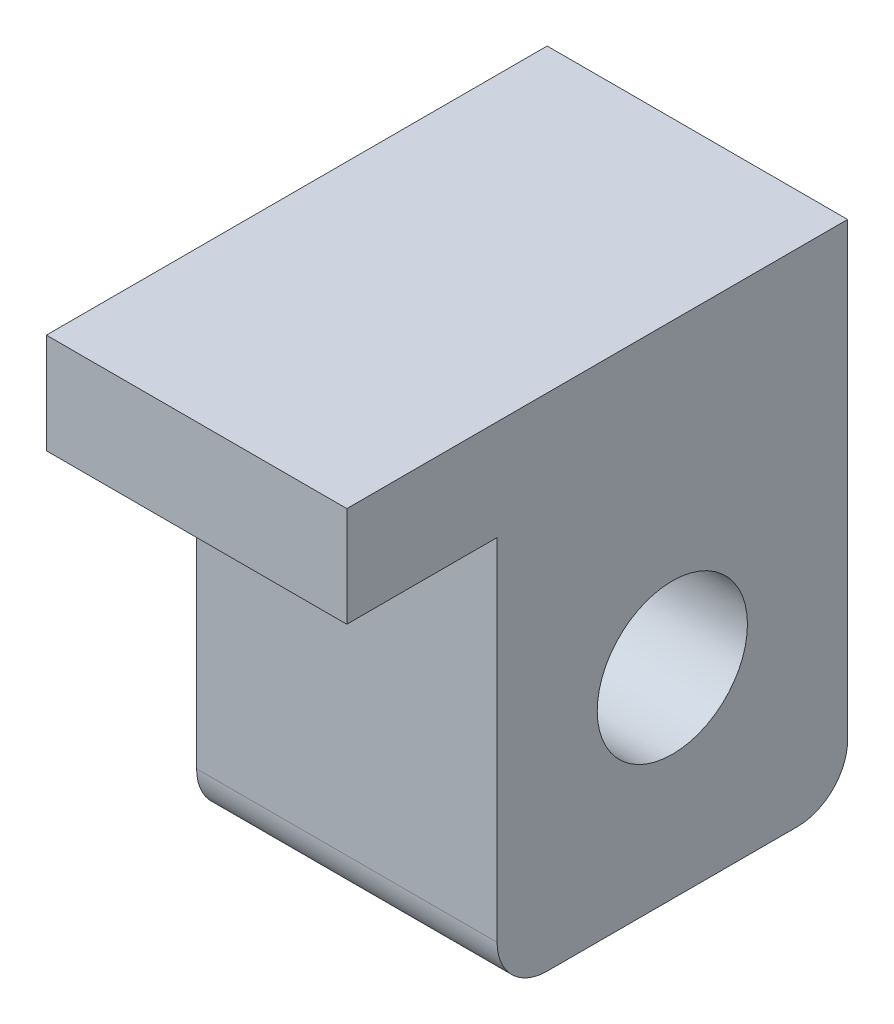
ISO-10303-21;
HEADER;
FILE_DESCRIPTION(('STEP AP214'),'2;1');
FILE_NAME('part.step','',(''),(''),'','','');
FILE_SCHEMA(('AUTOMOTIVE_DESIGN { 1 0 10303 214 1 1 1 1 }'));
ENDSEC;
DATA;
#1=APPLICATION_CONTEXT('core data for automotive mechanical design processes');
#2=APPLICATION_PROTOCOL_DEFINITION('international standard','automotive_design',2000,#1);
#3=PRODUCT_CONTEXT('',#1,'mechanical');
#4=PRODUCT('Part','Part','',(#3));
#5=PRODUCT_RELATED_PRODUCT_CATEGORY('part','',(#4));
#6=PRODUCT_DEFINITION_FORMATION('','',#4);
#7=PRODUCT_DEFINITION_CONTEXT('part definition',#1,'design');
#8=PRODUCT_DEFINITION('design','',#6,#7);
#9=PRODUCT_DEFINITION_SHAPE('','',#8);
#10=(LENGTH_UNIT() NAMED_UNIT(*) SI_UNIT(.MILLI.,.METRE.));
#11=(NAMED_UNIT(*) PLANE_ANGLE_UNIT() SI_UNIT($,.RADIAN.));
#12=(NAMED_UNIT(*) SI_UNIT($,.STERADIAN.) SOLID_ANGLE_UNIT());
#13=UNCERTAINTY_MEASURE_WITH_UNIT(LENGTH_MEASURE(1.E-05),#10,'distance_accuracy_value','');
#14=(GEOMETRIC_REPRESENTATION_CONTEXT(3) GLOBAL_UNCERTAINTY_ASSIGNED_CONTEXT((#13)) GLOBAL_UNIT_ASSIGNED_CONTEXT((#10,
#11,#12)) REPRESENTATION_CONTEXT('',''));
#15=CARTESIAN_POINT('',(0.,0.,0.));
#16=DIRECTION('',(0.,0.,1.));
#17=DIRECTION('',(1.,0.,0.));
#18=AXIS2_PLACEMENT_3D('',#15,#16,#17);
#19=CARTESIAN_POINT('',(30.,-25.,17.5));
#20=DIRECTION('',(0.,0.,-1.));
#21=DIRECTION('',(-1.,0.,0.));
#22=AXIS2_PLACEMENT_3D('',#19,#20,#21);
#23=PLANE('',#22);
#24=DIRECTION('',(-1.,0.,0.));
#25=VECTOR('',#24,1.);
#26=CARTESIAN_POINT('',(30.,15.,17.5));
#27=LINE('',#26,#25);
#28=CARTESIAN_POINT('',(30.,15.,17.5));
#29=VERTEX_POINT('',#28);
#30=CARTESIAN_POINT('',(0.,15.,17.5));
#31=VERTEX_POINT('',#30);
#32=EDGE_CURVE('E116',#29,#31,#27,.T.);
#33=ORIENTED_EDGE('',*,*,#32,.T.);
#34=DIRECTION('',(0.,-1.,0.));
#35=VECTOR('',#34,1.);
#36=CARTESIAN_POINT('',(0.,-25.,17.5));
#37=LINE('',#36,#35);
#38=CARTESIAN_POINT('',(0.,-20.,17.5));
#39=VERTEX_POINT('',#38);
#40=EDGE_CURVE('E104',#31,#39,#37,.T.);
#41=ORIENTED_EDGE('',*,*,#40,.T.);
#42=DIRECTION('',(-1.,0.,0.));
#43=VECTOR('',#42,1.);
#44=CARTESIAN_POINT('',(30.,-20.,17.5));
#45=LINE('',#44,#43);
#46=CARTESIAN_POINT('',(30.,-20.,17.5));
#47=VERTEX_POINT('',#46);
#48=EDGE_CURVE('E49',#39,#47,#45,.F.);
#49=ORIENTED_EDGE('',*,*,#48,.T.);
#50=DIRECTION('',(0.,-1.,0.));
#51=VECTOR('',#50,1.);
#52=CARTESIAN_POINT('',(30.,-25.,17.5));
#53=LINE('',#52,#51);
#54=EDGE_CURVE('E56',#29,#47,#53,.T.);
#55=ORIENTED_EDGE('',*,*,#54,.F.);
#56=EDGE_LOOP('',(#33,#41,#49,#55));
#57=FACE_BOUND('',#56,.T.);
#58=ADVANCED_FACE('F41',(#57),#23,.F.);
#59=CARTESIAN_POINT('',(30.,-25.,-17.5));
#60=DIRECTION('',(0.,0.,1.));
#61=DIRECTION('',(1.,0.,0.));
#62=AXIS2_PLACEMENT_3D('',#59,#60,#61);
#63=PLANE('',#62);
#64=DIRECTION('',(0.,1.,0.));
#65=VECTOR('',#64,1.);
#66=CARTESIAN_POINT('',(30.,-25.,-17.5));
#67=LINE('',#66,#65);
#68=CARTESIAN_POINT('',(30.,-20.,-17.5));
#69=VERTEX_POINT('',#68);
#70=CARTESIAN_POINT('',(30.,25.,-17.5));
#71=VERTEX_POINT('',#70);
#72=EDGE_CURVE('E167',#69,#71,#67,.T.);
#73=ORIENTED_EDGE('',*,*,#72,.F.);
#74=DIRECTION('',(-1.,0.,0.));
#75=VECTOR('',#74,1.);
#76=CARTESIAN_POINT('',(30.,-20.,-17.5));
#77=LINE('',#76,#75);
#78=CARTESIAN_POINT('',(0.,-20.,-17.5));
#79=VERTEX_POINT('',#78);
#80=EDGE_CURVE('E180',#69,#79,#77,.T.);
#81=ORIENTED_EDGE('',*,*,#80,.T.);
#82=DIRECTION('',(0.,1.,0.));
#83=VECTOR('',#82,1.);
#84=CARTESIAN_POINT('',(0.,-25.,-17.5));
#85=LINE('',#84,#83);
#86=CARTESIAN_POINT('',(0.,25.,-17.5));
#87=VERTEX_POINT('',#86);
#88=EDGE_CURVE('E166',#79,#87,#85,.T.);
#89=ORIENTED_EDGE('',*,*,#88,.T.);
#90=DIRECTION('',(-1.,0.,0.));
#91=VECTOR('',#90,1.);
#92=CARTESIAN_POINT('',(30.,25.,-17.5));
#93=LINE('',#92,#91);
#94=EDGE_CURVE('E174',#71,#87,#93,.T.);
#95=ORIENTED_EDGE('',*,*,#94,.F.);
#96=EDGE_LOOP('',(#73,#81,#89,#95));
#97=FACE_BOUND('',#96,.T.);
#98=ADVANCED_FACE('F210',(#97),#63,.F.);
#99=CARTESIAN_POINT('',(30.,25.,17.5));
#100=DIRECTION('',(0.,-1.,0.));
#101=DIRECTION('',(0.,0.,-1.));
#102=AXIS2_PLACEMENT_3D('',#99,#100,#101);
#103=PLANE('',#102);
#104=DIRECTION('',(0.,0.,1.));
#105=VECTOR('',#104,1.);
#106=CARTESIAN_POINT('',(0.,25.,17.5));
#107=LINE('',#106,#105);
#108=CARTESIAN_POINT('',(0.,25.,32.5));
#109=VERTEX_POINT('',#108);
#110=EDGE_CURVE('E114',#87,#109,#107,.T.);
#111=ORIENTED_EDGE('',*,*,#110,.T.);
#112=DIRECTION('',(1.,0.,0.));
#113=VECTOR('',#112,1.);
#114=CARTESIAN_POINT('',(30.,25.,32.5));
#115=LINE('',#114,#113);
#116=CARTESIAN_POINT('',(30.,25.,32.5));
#117=VERTEX_POINT('',#116);
#118=EDGE_CURVE('E129',#109,#117,#115,.T.);
#119=ORIENTED_EDGE('',*,*,#118,.T.);
#120=DIRECTION('',(0.,0.,1.));
#121=VECTOR('',#120,1.);
#122=CARTESIAN_POINT('',(30.,25.,17.5));
#123=LINE('',#122,#121);
#124=EDGE_CURVE('E169',#71,#117,#123,.T.);
#125=ORIENTED_EDGE('',*,*,#124,.F.);
#126=ORIENTED_EDGE('',*,*,#94,.T.);
#127=EDGE_LOOP('',(#111,#119,#125,#126));
#128=FACE_BOUND('',#127,.T.);
#129=ADVANCED_FACE('F214',(#128),#103,.F.);
#130=CARTESIAN_POINT('',(30.,-25.,17.5));
#131=DIRECTION('',(0.,1.,0.));
#132=DIRECTION('',(0.,0.,1.));
#133=AXIS2_PLACEMENT_3D('',#130,#131,#132);
#134=PLANE('',#133);
#135=DIRECTION('',(0.,0.,-1.));
#136=VECTOR('',#135,1.);
#137=CARTESIAN_POINT('',(30.,-25.,17.5));
#138=LINE('',#137,#136);
#139=CARTESIAN_POINT('',(30.,-25.,12.5));
#140=VERTEX_POINT('',#139);
#141=CARTESIAN_POINT('',(30.,-25.,-12.5));
#142=VERTEX_POINT('',#141);
#143=EDGE_CURVE('E172',#140,#142,#138,.T.);
#144=ORIENTED_EDGE('',*,*,#143,.F.);
#145=DIRECTION('',(-1.,0.,0.));
#146=VECTOR('',#145,1.);
#147=CARTESIAN_POINT('',(30.,-25.,12.5));
#148=LINE('',#147,#146);
#149=CARTESIAN_POINT('',(0.,-25.,12.5));
#150=VERTEX_POINT('',#149);
#151=EDGE_CURVE('E191',#140,#150,#148,.T.);
#152=ORIENTED_EDGE('',*,*,#151,.T.);
#153=DIRECTION('',(0.,0.,-1.));
#154=VECTOR('',#153,1.);
#155=CARTESIAN_POINT('',(0.,-25.,17.5));
#156=LINE('',#155,#154);
#157=CARTESIAN_POINT('',(0.,-25.,-12.5));
#158=VERTEX_POINT('',#157);
#159=EDGE_CURVE('E113',#150,#158,#156,.T.);
#160=ORIENTED_EDGE('',*,*,#159,.T.);
#161=DIRECTION('',(-1.,0.,0.));
#162=VECTOR('',#161,1.);
#163=CARTESIAN_POINT('',(30.,-25.,-12.5));
#164=LINE('',#163,#162);
#165=EDGE_CURVE('E186',#158,#142,#164,.F.);
#166=ORIENTED_EDGE('',*,*,#165,.T.);
#167=EDGE_LOOP('',(#144,#152,#160,#166));
#168=FACE_BOUND('',#167,.T.);
#169=ADVANCED_FACE('F200',(#168),#134,.F.);
#170=CARTESIAN_POINT('',(30.,0.,0.));
#171=DIRECTION('',(-1.,0.,0.));
#172=DIRECTION('',(0.,0.,1.));
#173=AXIS2_PLACEMENT_3D('',#170,#171,#172);
#174=PLANE('',#173);
#175=CARTESIAN_POINT('',(30.,-5.,0.));
#176=DIRECTION('',(-1.,0.,0.));
#177=DIRECTION('',(0.,0.,1.));
#178=AXIS2_PLACEMENT_3D('',#175,#176,#177);
#179=CIRCLE('',#178,7.5);
#180=CARTESIAN_POINT('',(30.,-5.,7.5));
#181=VERTEX_POINT('',#180);
#182=EDGE_CURVE('E163',#181,#181,#179,.T.);
#183=ORIENTED_EDGE('',*,*,#182,.T.);
#184=EDGE_LOOP('',(#183));
#185=FACE_BOUND('',#184,.T.);
#186=ORIENTED_EDGE('',*,*,#124,.T.);
#187=DIRECTION('',(0.,1.,0.));
#188=VECTOR('',#187,1.);
#189=CARTESIAN_POINT('',(30.,15.,32.5));
#190=LINE('',#189,#188);
#191=CARTESIAN_POINT('',(30.,15.,32.5));
#192=VERTEX_POINT('',#191);
#193=EDGE_CURVE('E132',#192,#117,#190,.T.);
#194=ORIENTED_EDGE('',*,*,#193,.F.);
#195=DIRECTION('',(0.,0.,-1.));
#196=VECTOR('',#195,1.);
#197=CARTESIAN_POINT('',(30.,15.,32.5));
#198=LINE('',#197,#196);
#199=EDGE_CURVE('E119',#192,#29,#198,.T.);
#200=ORIENTED_EDGE('',*,*,#199,.T.);
#201=ORIENTED_EDGE('',*,*,#54,.T.);
#202=CARTESIAN_POINT('',(30.,-20.,12.5));
#203=DIRECTION('',(-1.,0.,0.));
#204=DIRECTION('',(0.,0.,1.));
#205=AXIS2_PLACEMENT_3D('',#202,#203,#204);
#206=CIRCLE('',#205,5.);
#207=EDGE_CURVE('E11',#47,#140,#206,.F.);
#208=ORIENTED_EDGE('',*,*,#207,.T.);
#209=ORIENTED_EDGE('',*,*,#143,.T.);
#210=CARTESIAN_POINT('',(30.,-20.,-12.5));
#211=DIRECTION('',(-1.,0.,0.));
#212=DIRECTION('',(0.,0.,1.));
#213=AXIS2_PLACEMENT_3D('',#210,#211,#212);
#214=CIRCLE('',#213,5.);
#215=EDGE_CURVE('E189',#142,#69,#214,.F.);
#216=ORIENTED_EDGE('',*,*,#215,.T.);
#217=ORIENTED_EDGE('',*,*,#72,.T.);
#218=EDGE_LOOP('',(#186,#194,#200,#201,#208,#209,#216,#217));
#219=FACE_BOUND('',#218,.T.);
#220=ADVANCED_FACE('F198',(#185,#219),#174,.F.);
#221=CARTESIAN_POINT('',(0.,0.,0.));
#222=DIRECTION('',(-1.,0.,0.));
#223=DIRECTION('',(0.,0.,1.));
#224=AXIS2_PLACEMENT_3D('',#221,#222,#223);
#225=PLANE('',#224);
#226=CARTESIAN_POINT('',(0.,-16.3137084989858,11.3137084989854));
#227=DIRECTION('',(-1.,0.,0.));
#228=DIRECTION('',(0.,0.,1.));
#229=AXIS2_PLACEMENT_3D('',#226,#227,#228);
#230=CIRCLE('',#229,2.74999999999982);
#231=CARTESIAN_POINT('',(0.,-16.3137084989858,14.0637084989852));
#232=VERTEX_POINT('',#231);
#233=EDGE_CURVE('E150',#232,#232,#230,.T.);
#234=ORIENTED_EDGE('',*,*,#233,.F.);
#235=EDGE_LOOP('',(#234));
#236=FACE_BOUND('',#235,.T.);
#237=CARTESIAN_POINT('',(0.,-16.3137084989858,-11.3137084989841));
#238=DIRECTION('',(-1.,0.,0.));
#239=DIRECTION('',(0.,0.,1.));
#240=AXIS2_PLACEMENT_3D('',#237,#238,#239);
#241=CIRCLE('',#240,2.74999999999982);
#242=CARTESIAN_POINT('',(0.,-16.3137084989858,-8.56370849898425));
#243=VERTEX_POINT('',#242);
#244=EDGE_CURVE('E144',#243,#243,#241,.T.);
#245=ORIENTED_EDGE('',*,*,#244,.F.);
#246=EDGE_LOOP('',(#245));
#247=FACE_BOUND('',#246,.T.);
#248=CARTESIAN_POINT('',(0.,6.31370849898377,-11.3137084989841));
#249=DIRECTION('',(-1.,0.,0.));
#250=DIRECTION('',(0.,0.,1.));
#251=AXIS2_PLACEMENT_3D('',#248,#249,#250);
#252=CIRCLE('',#251,2.74999999999982);
#253=CARTESIAN_POINT('',(0.,6.31370849898377,-8.56370849898425));
#254=VERTEX_POINT('',#253);
#255=EDGE_CURVE('E137',#254,#254,#252,.T.);
#256=ORIENTED_EDGE('',*,*,#255,.F.);
#257=EDGE_LOOP('',(#256));
#258=FACE_BOUND('',#257,.T.);
#259=CARTESIAN_POINT('',(0.,6.31370849898377,11.3137084989854));
#260=DIRECTION('',(-1.,0.,0.));
#261=DIRECTION('',(0.,0.,1.));
#262=AXIS2_PLACEMENT_3D('',#259,#260,#261);
#263=CIRCLE('',#262,2.74999999999982);
#264=CARTESIAN_POINT('',(0.,6.31370849898377,14.0637084989852));
#265=VERTEX_POINT('',#264);
#266=EDGE_CURVE('E140',#265,#265,#263,.T.);
#267=ORIENTED_EDGE('',*,*,#266,.F.);
#268=EDGE_LOOP('',(#267));
#269=FACE_BOUND('',#268,.T.);
#270=CARTESIAN_POINT('',(0.,-5.,0.));
#271=DIRECTION('',(1.,0.,0.));
#272=DIRECTION('',(0.,0.,-1.));
#273=AXIS2_PLACEMENT_3D('',#270,#271,#272);
#274=CIRCLE('',#273,7.5);
#275=CARTESIAN_POINT('',(0.,-5.,-7.5));
#276=VERTEX_POINT('',#275);
#277=EDGE_CURVE('E158',#276,#276,#274,.T.);
#278=ORIENTED_EDGE('',*,*,#277,.T.);
#279=EDGE_LOOP('',(#278));
#280=FACE_BOUND('',#279,.T.);
#281=ORIENTED_EDGE('',*,*,#159,.F.);
#282=CARTESIAN_POINT('',(0.,-20.,12.5));
#283=DIRECTION('',(-1.,0.,0.));
#284=DIRECTION('',(0.,0.,1.));
#285=AXIS2_PLACEMENT_3D('',#282,#283,#284);
#286=CIRCLE('',#285,5.);
#287=EDGE_CURVE('E111',#150,#39,#286,.T.);
#288=ORIENTED_EDGE('',*,*,#287,.T.);
#289=ORIENTED_EDGE('',*,*,#40,.F.);
#290=DIRECTION('',(0.,0.,1.));
#291=VECTOR('',#290,1.);
#292=CARTESIAN_POINT('',(0.,15.,32.5));
#293=LINE('',#292,#291);
#294=CARTESIAN_POINT('',(0.,15.,32.5));
#295=VERTEX_POINT('',#294);
#296=EDGE_CURVE('E109',#31,#295,#293,.T.);
#297=ORIENTED_EDGE('',*,*,#296,.T.);
#298=DIRECTION('',(0.,1.,0.));
#299=VECTOR('',#298,1.);
#300=CARTESIAN_POINT('',(0.,15.,32.5));
#301=LINE('',#300,#299);
#302=EDGE_CURVE('E125',#295,#109,#301,.T.);
#303=ORIENTED_EDGE('',*,*,#302,.T.);
#304=ORIENTED_EDGE('',*,*,#110,.F.);
#305=ORIENTED_EDGE('',*,*,#88,.F.);
#306=CARTESIAN_POINT('',(0.,-20.,-12.5));
#307=DIRECTION('',(-1.,0.,0.));
#308=DIRECTION('',(0.,0.,1.));
#309=AXIS2_PLACEMENT_3D('',#306,#307,#308);
#310=CIRCLE('',#309,5.);
#311=EDGE_CURVE('E183',#79,#158,#310,.T.);
#312=ORIENTED_EDGE('',*,*,#311,.T.);
#313=EDGE_LOOP('',(#281,#288,#289,#297,#303,#304,#305,#312));
#314=FACE_BOUND('',#313,.T.);
#315=ADVANCED_FACE('F106',(#236,#247,#258,#269,#280,#314),#225,.T.);
#316=CARTESIAN_POINT('',(0.,-5.,0.));
#317=DIRECTION('',(1.,0.,0.));
#318=DIRECTION('',(0.,0.,-1.));
#319=AXIS2_PLACEMENT_3D('',#316,#317,#318);
#320=CYLINDRICAL_SURFACE('',#319,7.5);
#321=ORIENTED_EDGE('',*,*,#277,.F.);
#322=EDGE_LOOP('',(#321));
#323=FACE_BOUND('',#322,.T.);
#324=ORIENTED_EDGE('',*,*,#182,.F.);
#325=EDGE_LOOP('',(#324));
#326=FACE_BOUND('',#325,.T.);
#327=ADVANCED_FACE('F242',(#323,#326),#320,.F.);
#328=CARTESIAN_POINT('',(30.,-20.,-12.5));
#329=DIRECTION('',(-1.,0.,0.));
#330=DIRECTION('',(0.,0.,1.));
#331=AXIS2_PLACEMENT_3D('',#328,#329,#330);
#332=CYLINDRICAL_SURFACE('',#331,5.);
#333=ORIENTED_EDGE('',*,*,#215,.F.);
#334=ORIENTED_EDGE('',*,*,#165,.F.);
#335=ORIENTED_EDGE('',*,*,#311,.F.);
#336=ORIENTED_EDGE('',*,*,#80,.F.);
#337=EDGE_LOOP('',(#333,#334,#335,#336));
#338=FACE_BOUND('',#337,.T.);
#339=ADVANCED_FACE('F205',(#338),#332,.T.);
#340=CARTESIAN_POINT('',(30.,-20.,12.5));
#341=DIRECTION('',(-1.,0.,0.));
#342=DIRECTION('',(0.,0.,1.));
#343=AXIS2_PLACEMENT_3D('',#340,#341,#342);
#344=CYLINDRICAL_SURFACE('',#343,5.);
#345=ORIENTED_EDGE('',*,*,#207,.F.);
#346=ORIENTED_EDGE('',*,*,#48,.F.);
#347=ORIENTED_EDGE('',*,*,#287,.F.);
#348=ORIENTED_EDGE('',*,*,#151,.F.);
#349=EDGE_LOOP('',(#345,#346,#347,#348));
#350=FACE_BOUND('',#349,.T.);
#351=ADVANCED_FACE('F43',(#350),#344,.T.);
#352=CARTESIAN_POINT('',(20.,6.31370849898377,11.3137084989854));
#353=DIRECTION('',(-1.,0.,0.));
#354=DIRECTION('',(0.,0.,1.));
#355=AXIS2_PLACEMENT_3D('',#352,#353,#354);
#356=CYLINDRICAL_SURFACE('',#355,2.74999999999982);
#357=CARTESIAN_POINT('',(20.,6.31370849898377,11.3137084989854));
#358=DIRECTION('',(-1.,0.,0.));
#359=DIRECTION('',(0.,0.,1.));
#360=AXIS2_PLACEMENT_3D('',#357,#358,#359);
#361=CIRCLE('',#360,2.74999999999982);
#362=CARTESIAN_POINT('',(20.,6.31370849898377,14.0637084989852));
#363=VERTEX_POINT('',#362);
#364=EDGE_CURVE('E155',#363,#363,#361,.T.);
#365=ORIENTED_EDGE('',*,*,#364,.F.);
#366=EDGE_LOOP('',(#365));
#367=FACE_BOUND('',#366,.T.);
#368=ORIENTED_EDGE('',*,*,#266,.T.);
#369=EDGE_LOOP('',(#368));
#370=FACE_BOUND('',#369,.T.);
#371=ADVANCED_FACE('F247',(#367,#370),#356,.F.);
#372=CARTESIAN_POINT('',(20.,6.31370849898377,11.3137084989854));
#373=DIRECTION('',(-1.,0.,0.));
#374=DIRECTION('',(0.,0.,1.));
#375=AXIS2_PLACEMENT_3D('',#372,#373,#374);
#376=PLANE('',#375);
#377=ORIENTED_EDGE('',*,*,#364,.T.);
#378=EDGE_LOOP('',(#377));
#379=FACE_BOUND('',#378,.T.);
#380=ADVANCED_FACE('F280',(#379),#376,.T.);
#381=CARTESIAN_POINT('',(20.,6.31370849898377,-11.3137084989841));
#382=DIRECTION('',(-1.,0.,0.));
#383=DIRECTION('',(0.,0.,1.));
#384=AXIS2_PLACEMENT_3D('',#381,#382,#383);
#385=CYLINDRICAL_SURFACE('',#384,2.74999999999982);
#386=CARTESIAN_POINT('',(20.,6.31370849898377,-11.3137084989841));
#387=DIRECTION('',(-1.,0.,0.));
#388=DIRECTION('',(0.,0.,1.));
#389=AXIS2_PLACEMENT_3D('',#386,#387,#388);
#390=CIRCLE('',#389,2.74999999999982);
#391=CARTESIAN_POINT('',(20.,6.31370849898377,-8.56370849898425));
#392=VERTEX_POINT('',#391);
#393=EDGE_CURVE('E141',#392,#392,#390,.T.);
#394=ORIENTED_EDGE('',*,*,#393,.F.);
#395=EDGE_LOOP('',(#394));
#396=FACE_BOUND('',#395,.T.);
#397=ORIENTED_EDGE('',*,*,#255,.T.);
#398=EDGE_LOOP('',(#397));
#399=FACE_BOUND('',#398,.T.);
#400=ADVANCED_FACE('F288',(#396,#399),#385,.F.);
#401=CARTESIAN_POINT('',(20.,6.31370849898377,-11.3137084989841));
#402=DIRECTION('',(-1.,0.,0.));
#403=DIRECTION('',(0.,0.,1.));
#404=AXIS2_PLACEMENT_3D('',#401,#402,#403);
#405=PLANE('',#404);
#406=ORIENTED_EDGE('',*,*,#393,.T.);
#407=EDGE_LOOP('',(#406));
#408=FACE_BOUND('',#407,.T.);
#409=ADVANCED_FACE('F296',(#408),#405,.T.);
#410=CARTESIAN_POINT('',(20.,-16.3137084989858,-11.3137084989841));
#411=DIRECTION('',(-1.,0.,0.));
#412=DIRECTION('',(0.,0.,1.));
#413=AXIS2_PLACEMENT_3D('',#410,#411,#412);
#414=CYLINDRICAL_SURFACE('',#413,2.74999999999982);
#415=CARTESIAN_POINT('',(20.,-16.3137084989858,-11.3137084989841));
#416=DIRECTION('',(-1.,0.,0.));
#417=DIRECTION('',(0.,0.,1.));
#418=AXIS2_PLACEMENT_3D('',#415,#416,#417);
#419=CIRCLE('',#418,2.74999999999982);
#420=CARTESIAN_POINT('',(20.,-16.3137084989858,-8.56370849898425));
#421=VERTEX_POINT('',#420);
#422=EDGE_CURVE('E147',#421,#421,#419,.T.);
#423=ORIENTED_EDGE('',*,*,#422,.F.);
#424=EDGE_LOOP('',(#423));
#425=FACE_BOUND('',#424,.T.);
#426=ORIENTED_EDGE('',*,*,#244,.T.);
#427=EDGE_LOOP('',(#426));
#428=FACE_BOUND('',#427,.T.);
#429=ADVANCED_FACE('F304',(#425,#428),#414,.F.);
#430=CARTESIAN_POINT('',(20.,-16.3137084989858,-11.3137084989841));
#431=DIRECTION('',(-1.,0.,0.));
#432=DIRECTION('',(0.,0.,1.));
#433=AXIS2_PLACEMENT_3D('',#430,#431,#432);
#434=PLANE('',#433);
#435=ORIENTED_EDGE('',*,*,#422,.T.);
#436=EDGE_LOOP('',(#435));
#437=FACE_BOUND('',#436,.T.);
#438=ADVANCED_FACE('F313',(#437),#434,.T.);
#439=CARTESIAN_POINT('',(20.,-16.3137084989858,11.3137084989854));
#440=DIRECTION('',(-1.,0.,0.));
#441=DIRECTION('',(0.,0.,1.));
#442=AXIS2_PLACEMENT_3D('',#439,#440,#441);
#443=CYLINDRICAL_SURFACE('',#442,2.74999999999982);
#444=CARTESIAN_POINT('',(20.,-16.3137084989858,11.3137084989854));
#445=DIRECTION('',(-1.,0.,0.));
#446=DIRECTION('',(0.,0.,1.));
#447=AXIS2_PLACEMENT_3D('',#444,#445,#446);
#448=CIRCLE('',#447,2.74999999999982);
#449=CARTESIAN_POINT('',(20.,-16.3137084989858,14.0637084989852));
#450=VERTEX_POINT('',#449);
#451=EDGE_CURVE('E135',#450,#450,#448,.T.);
#452=ORIENTED_EDGE('',*,*,#451,.F.);
#453=EDGE_LOOP('',(#452));
#454=FACE_BOUND('',#453,.T.);
#455=ORIENTED_EDGE('',*,*,#233,.T.);
#456=EDGE_LOOP('',(#455));
#457=FACE_BOUND('',#456,.T.);
#458=ADVANCED_FACE('F227',(#454,#457),#443,.F.);
#459=CARTESIAN_POINT('',(20.,-16.3137084989858,11.3137084989854));
#460=DIRECTION('',(-1.,0.,0.));
#461=DIRECTION('',(0.,0.,1.));
#462=AXIS2_PLACEMENT_3D('',#459,#460,#461);
#463=PLANE('',#462);
#464=ORIENTED_EDGE('',*,*,#451,.T.);
#465=EDGE_LOOP('',(#464));
#466=FACE_BOUND('',#465,.T.);
#467=ADVANCED_FACE('F219',(#466),#463,.T.);
#468=CARTESIAN_POINT('',(30.,15.,32.5));
#469=DIRECTION('',(0.,0.,1.));
#470=DIRECTION('',(1.,0.,0.));
#471=AXIS2_PLACEMENT_3D('',#468,#469,#470);
#472=PLANE('',#471);
#473=ORIENTED_EDGE('',*,*,#118,.F.);
#474=ORIENTED_EDGE('',*,*,#302,.F.);
#475=DIRECTION('',(1.,0.,0.));
#476=VECTOR('',#475,1.);
#477=CARTESIAN_POINT('',(30.,15.,32.5));
#478=LINE('',#477,#476);
#479=EDGE_CURVE('E123',#295,#192,#478,.T.);
#480=ORIENTED_EDGE('',*,*,#479,.T.);
#481=ORIENTED_EDGE('',*,*,#193,.T.);
#482=EDGE_LOOP('',(#473,#474,#480,#481));
#483=FACE_BOUND('',#482,.T.);
#484=ADVANCED_FACE('F217',(#483),#472,.T.);
#485=CARTESIAN_POINT('',(0.,15.,0.));
#486=DIRECTION('',(0.,1.,0.));
#487=DIRECTION('',(0.,0.,1.));
#488=AXIS2_PLACEMENT_3D('',#485,#486,#487);
#489=PLANE('',#488);
#490=ORIENTED_EDGE('',*,*,#199,.F.);
#491=ORIENTED_EDGE('',*,*,#479,.F.);
#492=ORIENTED_EDGE('',*,*,#296,.F.);
#493=ORIENTED_EDGE('',*,*,#32,.F.);
#494=EDGE_LOOP('',(#490,#491,#492,#493));
#495=FACE_BOUND('',#494,.T.);
#496=ADVANCED_FACE('F121',(#495),#489,.F.);
#497=CLOSED_SHELL('',(#58,#98,#129,#169,#220,#315,#327,#339,#351,#371,#380,#400,#409,#429,#438,
#458,#467,#484,#496));
#498=MANIFOLD_SOLID_BREP('B2',#497);
#499=ADVANCED_BREP_SHAPE_REPRESENTATION('',(#18,#498),#14);
#500=SHAPE_DEFINITION_REPRESENTATION(#9,#499);
ENDSEC;
END-ISO-10303-21;
